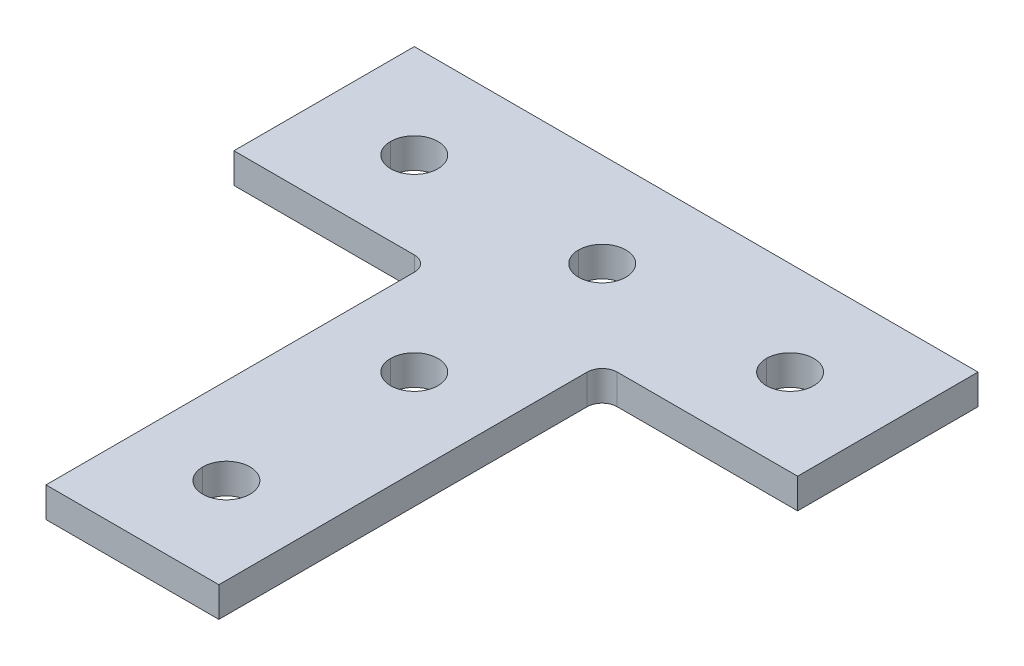
ISO-10303-21;
HEADER;
FILE_DESCRIPTION(('STEP AP214'),'2;1');
FILE_NAME('part.step','',(''),(''),'','','');
FILE_SCHEMA(('AUTOMOTIVE_DESIGN { 1 0 10303 214 1 1 1 1 }'));
ENDSEC;
DATA;
#1=APPLICATION_CONTEXT('core data for automotive mechanical design processes');
#2=APPLICATION_PROTOCOL_DEFINITION('international standard','automotive_design',2000,#1);
#3=PRODUCT_CONTEXT('',#1,'mechanical');
#4=PRODUCT('Part','Part','',(#3));
#5=PRODUCT_RELATED_PRODUCT_CATEGORY('part','',(#4));
#6=PRODUCT_DEFINITION_FORMATION('','',#4);
#7=PRODUCT_DEFINITION_CONTEXT('part definition',#1,'design');
#8=PRODUCT_DEFINITION('design','',#6,#7);
#9=PRODUCT_DEFINITION_SHAPE('','',#8);
#10=(LENGTH_UNIT() NAMED_UNIT(*) SI_UNIT(.MILLI.,.METRE.));
#11=(NAMED_UNIT(*) PLANE_ANGLE_UNIT() SI_UNIT($,.RADIAN.));
#12=(NAMED_UNIT(*) SI_UNIT($,.STERADIAN.) SOLID_ANGLE_UNIT());
#13=UNCERTAINTY_MEASURE_WITH_UNIT(LENGTH_MEASURE(1.E-05),#10,'distance_accuracy_value','');
#14=(GEOMETRIC_REPRESENTATION_CONTEXT(3) GLOBAL_UNCERTAINTY_ASSIGNED_CONTEXT((#13)) GLOBAL_UNIT_ASSIGNED_CONTEXT((#10,
#11,#12)) REPRESENTATION_CONTEXT('',''));
#15=CARTESIAN_POINT('',(0.,0.,0.));
#16=DIRECTION('',(0.,0.,1.));
#17=DIRECTION('',(1.,0.,0.));
#18=AXIS2_PLACEMENT_3D('',#15,#16,#17);
#19=CARTESIAN_POINT('',(37.5,4.,-37.5));
#20=DIRECTION('',(0.,0.,1.));
#21=DIRECTION('',(1.,0.,0.));
#22=AXIS2_PLACEMENT_3D('',#19,#20,#21);
#23=PLANE('',#22);
#24=DIRECTION('',(-1.,0.,0.));
#25=VECTOR('',#24,1.);
#26=CARTESIAN_POINT('',(37.5,0.,-37.5));
#27=LINE('',#26,#25);
#28=CARTESIAN_POINT('',(37.5,0.,-37.5));
#29=VERTEX_POINT('',#28);
#30=CARTESIAN_POINT('',(-37.5,0.,-37.5));
#31=VERTEX_POINT('',#30);
#32=EDGE_CURVE('E11',#29,#31,#27,.T.);
#33=ORIENTED_EDGE('',*,*,#32,.T.);
#34=DIRECTION('',(0.,-1.,0.));
#35=VECTOR('',#34,1.);
#36=CARTESIAN_POINT('',(-37.5,4.,-37.5));
#37=LINE('',#36,#35);
#38=CARTESIAN_POINT('',(-37.5,4.,-37.5));
#39=VERTEX_POINT('',#38);
#40=EDGE_CURVE('E25',#39,#31,#37,.T.);
#41=ORIENTED_EDGE('',*,*,#40,.F.);
#42=DIRECTION('',(-1.,0.,0.));
#43=VECTOR('',#42,1.);
#44=CARTESIAN_POINT('',(37.5,4.,-37.5));
#45=LINE('',#44,#43);
#46=CARTESIAN_POINT('',(37.5,4.,-37.5));
#47=VERTEX_POINT('',#46);
#48=EDGE_CURVE('E369',#47,#39,#45,.T.);
#49=ORIENTED_EDGE('',*,*,#48,.F.);
#50=DIRECTION('',(0.,-1.,0.));
#51=VECTOR('',#50,1.);
#52=CARTESIAN_POINT('',(37.5,4.,-37.5));
#53=LINE('',#52,#51);
#54=EDGE_CURVE('E365',#47,#29,#53,.T.);
#55=ORIENTED_EDGE('',*,*,#54,.T.);
#56=EDGE_LOOP('',(#33,#41,#49,#55));
#57=FACE_BOUND('',#56,.T.);
#58=ADVANCED_FACE('F17',(#57),#23,.F.);
#59=CARTESIAN_POINT('',(37.5,4.,-13.5));
#60=DIRECTION('',(-1.,0.,0.));
#61=DIRECTION('',(0.,0.,1.));
#62=AXIS2_PLACEMENT_3D('',#59,#60,#61);
#63=PLANE('',#62);
#64=DIRECTION('',(0.,0.,-1.));
#65=VECTOR('',#64,1.);
#66=CARTESIAN_POINT('',(37.5,0.,-13.5));
#67=LINE('',#66,#65);
#68=CARTESIAN_POINT('',(37.5,0.,-13.5));
#69=VERTEX_POINT('',#68);
#70=EDGE_CURVE('E360',#69,#29,#67,.T.);
#71=ORIENTED_EDGE('',*,*,#70,.T.);
#72=ORIENTED_EDGE('',*,*,#54,.F.);
#73=DIRECTION('',(0.,0.,-1.));
#74=VECTOR('',#73,1.);
#75=CARTESIAN_POINT('',(37.5,4.,-13.5));
#76=LINE('',#75,#74);
#77=CARTESIAN_POINT('',(37.5,4.,-13.5));
#78=VERTEX_POINT('',#77);
#79=EDGE_CURVE('E355',#78,#47,#76,.T.);
#80=ORIENTED_EDGE('',*,*,#79,.F.);
#81=DIRECTION('',(0.,-1.,0.));
#82=VECTOR('',#81,1.);
#83=CARTESIAN_POINT('',(37.5,4.,-13.5));
#84=LINE('',#83,#82);
#85=EDGE_CURVE('E351',#78,#69,#84,.T.);
#86=ORIENTED_EDGE('',*,*,#85,.T.);
#87=EDGE_LOOP('',(#71,#72,#80,#86));
#88=FACE_BOUND('',#87,.T.);
#89=ADVANCED_FACE('F381',(#88),#63,.F.);
#90=CARTESIAN_POINT('',(13.5,4.,-13.5));
#91=DIRECTION('',(0.,0.,-1.));
#92=DIRECTION('',(-1.,0.,0.));
#93=AXIS2_PLACEMENT_3D('',#90,#91,#92);
#94=PLANE('',#93);
#95=DIRECTION('',(1.,0.,0.));
#96=VECTOR('',#95,1.);
#97=CARTESIAN_POINT('',(13.5,0.,-13.5));
#98=LINE('',#97,#96);
#99=CARTESIAN_POINT('',(13.5,0.,-13.5));
#100=VERTEX_POINT('',#99);
#101=EDGE_CURVE('E346',#100,#69,#98,.T.);
#102=ORIENTED_EDGE('',*,*,#101,.T.);
#103=ORIENTED_EDGE('',*,*,#85,.F.);
#104=DIRECTION('',(1.,0.,0.));
#105=VECTOR('',#104,1.);
#106=CARTESIAN_POINT('',(13.5,4.,-13.5));
#107=LINE('',#106,#105);
#108=CARTESIAN_POINT('',(13.5,4.,-13.5));
#109=VERTEX_POINT('',#108);
#110=EDGE_CURVE('E341',#109,#78,#107,.T.);
#111=ORIENTED_EDGE('',*,*,#110,.F.);
#112=DIRECTION('',(0.,-1.,0.));
#113=VECTOR('',#112,1.);
#114=CARTESIAN_POINT('',(13.5,4.,-13.5));
#115=LINE('',#114,#113);
#116=EDGE_CURVE('E337',#109,#100,#115,.T.);
#117=ORIENTED_EDGE('',*,*,#116,.T.);
#118=EDGE_LOOP('',(#102,#103,#111,#117));
#119=FACE_BOUND('',#118,.T.);
#120=ADVANCED_FACE('F388',(#119),#94,.F.);
#121=CARTESIAN_POINT('',(13.5000000000003,4.,-11.4999999999997));
#122=DIRECTION('',(0.,1.,0.));
#123=DIRECTION('',(0.707106781186495,0.,0.707106781186601));
#124=AXIS2_PLACEMENT_3D('',#121,#122,#123);
#125=CYLINDRICAL_SURFACE('',#124,2.);
#126=DIRECTION('',(0.,-1.,0.));
#127=VECTOR('',#126,1.);
#128=CARTESIAN_POINT('',(11.5,4.,-11.5));
#129=LINE('',#128,#127);
#130=CARTESIAN_POINT('',(11.5,4.,-11.5));
#131=VERTEX_POINT('',#130);
#132=CARTESIAN_POINT('',(11.5,0.,-11.5));
#133=VERTEX_POINT('',#132);
#134=EDGE_CURVE('E333',#131,#133,#129,.T.);
#135=ORIENTED_EDGE('',*,*,#134,.T.);
#136=CARTESIAN_POINT('',(13.5000000000003,0.,-11.4999999999997));
#137=DIRECTION('',(0.,1.,0.));
#138=DIRECTION('',(1.,0.,0.));
#139=AXIS2_PLACEMENT_3D('',#136,#137,#138);
#140=CIRCLE('',#139,2.);
#141=EDGE_CURVE('E328',#100,#133,#140,.T.);
#142=ORIENTED_EDGE('',*,*,#141,.F.);
#143=ORIENTED_EDGE('',*,*,#116,.F.);
#144=CARTESIAN_POINT('',(13.5000000000003,4.,-11.4999999999997));
#145=DIRECTION('',(0.,1.,0.));
#146=DIRECTION('',(1.,0.,0.));
#147=AXIS2_PLACEMENT_3D('',#144,#145,#146);
#148=CIRCLE('',#147,2.);
#149=EDGE_CURVE('E324',#109,#131,#148,.T.);
#150=ORIENTED_EDGE('',*,*,#149,.T.);
#151=EDGE_LOOP('',(#135,#142,#143,#150));
#152=FACE_BOUND('',#151,.T.);
#153=ADVANCED_FACE('F392',(#152),#125,.F.);
#154=CARTESIAN_POINT('',(-13.5000000000003,4.,-11.4999999999997));
#155=DIRECTION('',(0.,1.,0.));
#156=DIRECTION('',(0.,0.,1.));
#157=AXIS2_PLACEMENT_3D('',#154,#155,#156);
#158=PLANE('',#157);
#159=CARTESIAN_POINT('',(-25.,4.,-25.));
#160=DIRECTION('',(0.,1.,0.));
#161=DIRECTION('',(1.,0.,0.));
#162=AXIS2_PLACEMENT_3D('',#159,#160,#161);
#163=CIRCLE('',#162,3.15);
#164=CARTESIAN_POINT('',(-21.85,4.,-25.));
#165=VERTEX_POINT('',#164);
#166=CARTESIAN_POINT('',(-28.15,4.,-25.));
#167=VERTEX_POINT('',#166);
#168=EDGE_CURVE('E319',#165,#167,#163,.T.);
#169=ORIENTED_EDGE('',*,*,#168,.F.);
#170=CARTESIAN_POINT('',(-25.,4.,-25.));
#171=DIRECTION('',(0.,1.,0.));
#172=DIRECTION('',(1.,0.,0.));
#173=AXIS2_PLACEMENT_3D('',#170,#171,#172);
#174=CIRCLE('',#173,3.15);
#175=EDGE_CURVE('E314',#167,#165,#174,.T.);
#176=ORIENTED_EDGE('',*,*,#175,.F.);
#177=EDGE_LOOP('',(#169,#176));
#178=FACE_BOUND('',#177,.T.);
#179=CARTESIAN_POINT('',(0.,4.,25.));
#180=DIRECTION('',(0.,1.,0.));
#181=DIRECTION('',(1.,0.,0.));
#182=AXIS2_PLACEMENT_3D('',#179,#180,#181);
#183=CIRCLE('',#182,3.15);
#184=CARTESIAN_POINT('',(3.15,4.,25.));
#185=VERTEX_POINT('',#184);
#186=CARTESIAN_POINT('',(-3.15,4.,25.));
#187=VERTEX_POINT('',#186);
#188=EDGE_CURVE('E309',#185,#187,#183,.T.);
#189=ORIENTED_EDGE('',*,*,#188,.F.);
#190=CARTESIAN_POINT('',(0.,4.,25.));
#191=DIRECTION('',(0.,1.,0.));
#192=DIRECTION('',(1.,0.,0.));
#193=AXIS2_PLACEMENT_3D('',#190,#191,#192);
#194=CIRCLE('',#193,3.15);
#195=EDGE_CURVE('E304',#187,#185,#194,.T.);
#196=ORIENTED_EDGE('',*,*,#195,.F.);
#197=EDGE_LOOP('',(#189,#196));
#198=FACE_BOUND('',#197,.T.);
#199=CARTESIAN_POINT('',(0.,4.,0.));
#200=DIRECTION('',(0.,1.,0.));
#201=DIRECTION('',(1.,0.,0.));
#202=AXIS2_PLACEMENT_3D('',#199,#200,#201);
#203=CIRCLE('',#202,3.15);
#204=CARTESIAN_POINT('',(3.15,4.,0.));
#205=VERTEX_POINT('',#204);
#206=CARTESIAN_POINT('',(-3.15,4.,0.));
#207=VERTEX_POINT('',#206);
#208=EDGE_CURVE('E299',#205,#207,#203,.T.);
#209=ORIENTED_EDGE('',*,*,#208,.F.);
#210=CARTESIAN_POINT('',(0.,4.,0.));
#211=DIRECTION('',(0.,1.,0.));
#212=DIRECTION('',(1.,0.,0.));
#213=AXIS2_PLACEMENT_3D('',#210,#211,#212);
#214=CIRCLE('',#213,3.15);
#215=EDGE_CURVE('E294',#207,#205,#214,.T.);
#216=ORIENTED_EDGE('',*,*,#215,.F.);
#217=EDGE_LOOP('',(#209,#216));
#218=FACE_BOUND('',#217,.T.);
#219=CARTESIAN_POINT('',(0.,4.,-25.));
#220=DIRECTION('',(0.,1.,0.));
#221=DIRECTION('',(1.,0.,0.));
#222=AXIS2_PLACEMENT_3D('',#219,#220,#221);
#223=CIRCLE('',#222,3.15);
#224=CARTESIAN_POINT('',(3.15,4.,-25.));
#225=VERTEX_POINT('',#224);
#226=CARTESIAN_POINT('',(-3.15,4.,-25.));
#227=VERTEX_POINT('',#226);
#228=EDGE_CURVE('E289',#225,#227,#223,.T.);
#229=ORIENTED_EDGE('',*,*,#228,.F.);
#230=CARTESIAN_POINT('',(0.,4.,-25.));
#231=DIRECTION('',(0.,1.,0.));
#232=DIRECTION('',(1.,0.,0.));
#233=AXIS2_PLACEMENT_3D('',#230,#231,#232);
#234=CIRCLE('',#233,3.15);
#235=EDGE_CURVE('E284',#227,#225,#234,.T.);
#236=ORIENTED_EDGE('',*,*,#235,.F.);
#237=EDGE_LOOP('',(#229,#236));
#238=FACE_BOUND('',#237,.T.);
#239=CARTESIAN_POINT('',(25.,4.,-25.));
#240=DIRECTION('',(0.,1.,0.));
#241=DIRECTION('',(1.,0.,0.));
#242=AXIS2_PLACEMENT_3D('',#239,#240,#241);
#243=CIRCLE('',#242,3.15);
#244=CARTESIAN_POINT('',(28.15,4.,-25.));
#245=VERTEX_POINT('',#244);
#246=CARTESIAN_POINT('',(21.85,4.,-25.));
#247=VERTEX_POINT('',#246);
#248=EDGE_CURVE('E279',#245,#247,#243,.T.);
#249=ORIENTED_EDGE('',*,*,#248,.F.);
#250=CARTESIAN_POINT('',(25.,4.,-25.));
#251=DIRECTION('',(0.,1.,0.));
#252=DIRECTION('',(1.,0.,0.));
#253=AXIS2_PLACEMENT_3D('',#250,#251,#252);
#254=CIRCLE('',#253,3.15);
#255=EDGE_CURVE('E274',#247,#245,#254,.T.);
#256=ORIENTED_EDGE('',*,*,#255,.F.);
#257=EDGE_LOOP('',(#249,#256));
#258=FACE_BOUND('',#257,.T.);
#259=DIRECTION('',(0.,0.,1.));
#260=VECTOR('',#259,1.);
#261=CARTESIAN_POINT('',(-37.5,4.,-37.5));
#262=LINE('',#261,#260);
#263=CARTESIAN_POINT('',(-37.5,4.,-13.5));
#264=VERTEX_POINT('',#263);
#265=EDGE_CURVE('E270',#39,#264,#262,.T.);
#266=ORIENTED_EDGE('',*,*,#265,.T.);
#267=DIRECTION('',(1.,0.,0.));
#268=VECTOR('',#267,1.);
#269=CARTESIAN_POINT('',(-37.5,4.,-13.5));
#270=LINE('',#269,#268);
#271=CARTESIAN_POINT('',(-13.5,4.,-13.5));
#272=VERTEX_POINT('',#271);
#273=EDGE_CURVE('E165',#264,#272,#270,.T.);
#274=ORIENTED_EDGE('',*,*,#273,.T.);
#275=CARTESIAN_POINT('',(-13.5000000000003,4.,-11.4999999999997));
#276=DIRECTION('',(0.,1.,0.));
#277=DIRECTION('',(1.,0.,0.));
#278=AXIS2_PLACEMENT_3D('',#275,#276,#277);
#279=CIRCLE('',#278,2.);
#280=CARTESIAN_POINT('',(-11.5,4.,-11.5));
#281=VERTEX_POINT('',#280);
#282=EDGE_CURVE('E262',#281,#272,#279,.T.);
#283=ORIENTED_EDGE('',*,*,#282,.F.);
#284=DIRECTION('',(0.,0.,1.));
#285=VECTOR('',#284,1.);
#286=CARTESIAN_POINT('',(-11.5,4.,-11.5));
#287=LINE('',#286,#285);
#288=CARTESIAN_POINT('',(-11.5,4.,37.5));
#289=VERTEX_POINT('',#288);
#290=EDGE_CURVE('E258',#281,#289,#287,.T.);
#291=ORIENTED_EDGE('',*,*,#290,.T.);
#292=DIRECTION('',(1.,0.,0.));
#293=VECTOR('',#292,1.);
#294=CARTESIAN_POINT('',(-11.5,4.,37.5));
#295=LINE('',#294,#293);
#296=CARTESIAN_POINT('',(11.5,4.,37.5));
#297=VERTEX_POINT('',#296);
#298=EDGE_CURVE('E254',#289,#297,#295,.T.);
#299=ORIENTED_EDGE('',*,*,#298,.T.);
#300=DIRECTION('',(0.,0.,-1.));
#301=VECTOR('',#300,1.);
#302=CARTESIAN_POINT('',(11.5,4.,37.5));
#303=LINE('',#302,#301);
#304=EDGE_CURVE('E249',#297,#131,#303,.T.);
#305=ORIENTED_EDGE('',*,*,#304,.T.);
#306=ORIENTED_EDGE('',*,*,#149,.F.);
#307=ORIENTED_EDGE('',*,*,#110,.T.);
#308=ORIENTED_EDGE('',*,*,#79,.T.);
#309=ORIENTED_EDGE('',*,*,#48,.T.);
#310=EDGE_LOOP('',(#266,#274,#283,#291,#299,#305,#306,#307,#308,#309));
#311=FACE_BOUND('',#310,.T.);
#312=ADVANCED_FACE('F378',(#178,#198,#218,#238,#258,#311),#158,.T.);
#313=CARTESIAN_POINT('',(11.5,4.,37.5));
#314=DIRECTION('',(-1.,0.,0.));
#315=DIRECTION('',(0.,0.,1.));
#316=AXIS2_PLACEMENT_3D('',#313,#314,#315);
#317=PLANE('',#316);
#318=DIRECTION('',(0.,0.,-1.));
#319=VECTOR('',#318,1.);
#320=CARTESIAN_POINT('',(11.5,0.,37.5));
#321=LINE('',#320,#319);
#322=CARTESIAN_POINT('',(11.5,0.,37.5));
#323=VERTEX_POINT('',#322);
#324=EDGE_CURVE('E244',#323,#133,#321,.T.);
#325=ORIENTED_EDGE('',*,*,#324,.T.);
#326=ORIENTED_EDGE('',*,*,#134,.F.);
#327=ORIENTED_EDGE('',*,*,#304,.F.);
#328=DIRECTION('',(0.,-1.,0.));
#329=VECTOR('',#328,1.);
#330=CARTESIAN_POINT('',(11.5,4.,37.5));
#331=LINE('',#330,#329);
#332=EDGE_CURVE('E240',#297,#323,#331,.T.);
#333=ORIENTED_EDGE('',*,*,#332,.T.);
#334=EDGE_LOOP('',(#325,#326,#327,#333));
#335=FACE_BOUND('',#334,.T.);
#336=ADVANCED_FACE('F396',(#335),#317,.F.);
#337=CARTESIAN_POINT('',(-11.5,4.,37.5));
#338=DIRECTION('',(0.,0.,-1.));
#339=DIRECTION('',(-1.,0.,0.));
#340=AXIS2_PLACEMENT_3D('',#337,#338,#339);
#341=PLANE('',#340);
#342=DIRECTION('',(1.,0.,0.));
#343=VECTOR('',#342,1.);
#344=CARTESIAN_POINT('',(-11.5,0.,37.5));
#345=LINE('',#344,#343);
#346=CARTESIAN_POINT('',(-11.5,0.,37.5));
#347=VERTEX_POINT('',#346);
#348=EDGE_CURVE('E235',#347,#323,#345,.T.);
#349=ORIENTED_EDGE('',*,*,#348,.T.);
#350=ORIENTED_EDGE('',*,*,#332,.F.);
#351=ORIENTED_EDGE('',*,*,#298,.F.);
#352=DIRECTION('',(0.,-1.,0.));
#353=VECTOR('',#352,1.);
#354=CARTESIAN_POINT('',(-11.5,4.,37.5));
#355=LINE('',#354,#353);
#356=EDGE_CURVE('E231',#289,#347,#355,.T.);
#357=ORIENTED_EDGE('',*,*,#356,.T.);
#358=EDGE_LOOP('',(#349,#350,#351,#357));
#359=FACE_BOUND('',#358,.T.);
#360=ADVANCED_FACE('F400',(#359),#341,.F.);
#361=CARTESIAN_POINT('',(-11.5,4.,-11.5));
#362=DIRECTION('',(1.,0.,0.));
#363=DIRECTION('',(0.,0.,-1.));
#364=AXIS2_PLACEMENT_3D('',#361,#362,#363);
#365=PLANE('',#364);
#366=DIRECTION('',(0.,0.,1.));
#367=VECTOR('',#366,1.);
#368=CARTESIAN_POINT('',(-11.5,0.,-11.5));
#369=LINE('',#368,#367);
#370=CARTESIAN_POINT('',(-11.5,0.,-11.5));
#371=VERTEX_POINT('',#370);
#372=EDGE_CURVE('E226',#371,#347,#369,.T.);
#373=ORIENTED_EDGE('',*,*,#372,.T.);
#374=ORIENTED_EDGE('',*,*,#356,.F.);
#375=ORIENTED_EDGE('',*,*,#290,.F.);
#376=DIRECTION('',(0.,-1.,0.));
#377=VECTOR('',#376,1.);
#378=CARTESIAN_POINT('',(-11.5,4.,-11.5));
#379=LINE('',#378,#377);
#380=EDGE_CURVE('E222',#281,#371,#379,.T.);
#381=ORIENTED_EDGE('',*,*,#380,.T.);
#382=EDGE_LOOP('',(#373,#374,#375,#381));
#383=FACE_BOUND('',#382,.T.);
#384=ADVANCED_FACE('F405',(#383),#365,.F.);
#385=CARTESIAN_POINT('',(-13.5000000000003,4.,-11.4999999999997));
#386=DIRECTION('',(0.,1.,0.));
#387=DIRECTION('',(-0.707106781186548,0.,0.707106781186547));
#388=AXIS2_PLACEMENT_3D('',#385,#386,#387);
#389=CYLINDRICAL_SURFACE('',#388,2.);
#390=DIRECTION('',(0.,-1.,0.));
#391=VECTOR('',#390,1.);
#392=CARTESIAN_POINT('',(-13.5,4.,-13.5));
#393=LINE('',#392,#391);
#394=CARTESIAN_POINT('',(-13.5,0.,-13.5));
#395=VERTEX_POINT('',#394);
#396=EDGE_CURVE('E218',#272,#395,#393,.T.);
#397=ORIENTED_EDGE('',*,*,#396,.T.);
#398=CARTESIAN_POINT('',(-13.5000000000003,0.,-11.4999999999997));
#399=DIRECTION('',(0.,1.,0.));
#400=DIRECTION('',(1.,0.,0.));
#401=AXIS2_PLACEMENT_3D('',#398,#399,#400);
#402=CIRCLE('',#401,2.);
#403=EDGE_CURVE('E157',#371,#395,#402,.T.);
#404=ORIENTED_EDGE('',*,*,#403,.F.);
#405=ORIENTED_EDGE('',*,*,#380,.F.);
#406=ORIENTED_EDGE('',*,*,#282,.T.);
#407=EDGE_LOOP('',(#397,#404,#405,#406));
#408=FACE_BOUND('',#407,.T.);
#409=ADVANCED_FACE('F408',(#408),#389,.F.);
#410=CARTESIAN_POINT('',(-13.5000000000003,0.,-11.4999999999997));
#411=DIRECTION('',(0.,1.,0.));
#412=DIRECTION('',(0.,0.,1.));
#413=AXIS2_PLACEMENT_3D('',#410,#411,#412);
#414=PLANE('',#413);
#415=CARTESIAN_POINT('',(-25.,0.,-25.));
#416=DIRECTION('',(0.,1.,0.));
#417=DIRECTION('',(1.,0.,0.));
#418=AXIS2_PLACEMENT_3D('',#415,#416,#417);
#419=CIRCLE('',#418,3.15);
#420=CARTESIAN_POINT('',(-21.85,0.,-25.));
#421=VERTEX_POINT('',#420);
#422=CARTESIAN_POINT('',(-28.15,0.,-25.));
#423=VERTEX_POINT('',#422);
#424=EDGE_CURVE('E211',#421,#423,#419,.T.);
#425=ORIENTED_EDGE('',*,*,#424,.T.);
#426=CARTESIAN_POINT('',(-25.,0.,-25.));
#427=DIRECTION('',(0.,1.,0.));
#428=DIRECTION('',(1.,0.,0.));
#429=AXIS2_PLACEMENT_3D('',#426,#427,#428);
#430=CIRCLE('',#429,3.15);
#431=EDGE_CURVE('E207',#423,#421,#430,.T.);
#432=ORIENTED_EDGE('',*,*,#431,.T.);
#433=EDGE_LOOP('',(#425,#432));
#434=FACE_BOUND('',#433,.T.);
#435=CARTESIAN_POINT('',(0.,0.,25.));
#436=DIRECTION('',(0.,1.,0.));
#437=DIRECTION('',(1.,0.,0.));
#438=AXIS2_PLACEMENT_3D('',#435,#436,#437);
#439=CIRCLE('',#438,3.15);
#440=CARTESIAN_POINT('',(3.15,0.,25.));
#441=VERTEX_POINT('',#440);
#442=CARTESIAN_POINT('',(-3.15,0.,25.));
#443=VERTEX_POINT('',#442);
#444=EDGE_CURVE('E203',#441,#443,#439,.T.);
#445=ORIENTED_EDGE('',*,*,#444,.T.);
#446=CARTESIAN_POINT('',(0.,0.,25.));
#447=DIRECTION('',(0.,1.,0.));
#448=DIRECTION('',(1.,0.,0.));
#449=AXIS2_PLACEMENT_3D('',#446,#447,#448);
#450=CIRCLE('',#449,3.15);
#451=EDGE_CURVE('E199',#443,#441,#450,.T.);
#452=ORIENTED_EDGE('',*,*,#451,.T.);
#453=EDGE_LOOP('',(#445,#452));
#454=FACE_BOUND('',#453,.T.);
#455=CARTESIAN_POINT('',(0.,0.,0.));
#456=DIRECTION('',(0.,1.,0.));
#457=DIRECTION('',(1.,0.,0.));
#458=AXIS2_PLACEMENT_3D('',#455,#456,#457);
#459=CIRCLE('',#458,3.15);
#460=CARTESIAN_POINT('',(3.15,0.,0.));
#461=VERTEX_POINT('',#460);
#462=CARTESIAN_POINT('',(-3.15,0.,0.));
#463=VERTEX_POINT('',#462);
#464=EDGE_CURVE('E195',#461,#463,#459,.T.);
#465=ORIENTED_EDGE('',*,*,#464,.T.);
#466=CARTESIAN_POINT('',(0.,0.,0.));
#467=DIRECTION('',(0.,1.,0.));
#468=DIRECTION('',(1.,0.,0.));
#469=AXIS2_PLACEMENT_3D('',#466,#467,#468);
#470=CIRCLE('',#469,3.15);
#471=EDGE_CURVE('E191',#463,#461,#470,.T.);
#472=ORIENTED_EDGE('',*,*,#471,.T.);
#473=EDGE_LOOP('',(#465,#472));
#474=FACE_BOUND('',#473,.T.);
#475=CARTESIAN_POINT('',(0.,0.,-25.));
#476=DIRECTION('',(0.,1.,0.));
#477=DIRECTION('',(1.,0.,0.));
#478=AXIS2_PLACEMENT_3D('',#475,#476,#477);
#479=CIRCLE('',#478,3.15);
#480=CARTESIAN_POINT('',(3.15,0.,-25.));
#481=VERTEX_POINT('',#480);
#482=CARTESIAN_POINT('',(-3.15,0.,-25.));
#483=VERTEX_POINT('',#482);
#484=EDGE_CURVE('E187',#481,#483,#479,.T.);
#485=ORIENTED_EDGE('',*,*,#484,.T.);
#486=CARTESIAN_POINT('',(0.,0.,-25.));
#487=DIRECTION('',(0.,1.,0.));
#488=DIRECTION('',(1.,0.,0.));
#489=AXIS2_PLACEMENT_3D('',#486,#487,#488);
#490=CIRCLE('',#489,3.15);
#491=EDGE_CURVE('E183',#483,#481,#490,.T.);
#492=ORIENTED_EDGE('',*,*,#491,.T.);
#493=EDGE_LOOP('',(#485,#492));
#494=FACE_BOUND('',#493,.T.);
#495=CARTESIAN_POINT('',(25.,0.,-25.));
#496=DIRECTION('',(0.,1.,0.));
#497=DIRECTION('',(1.,0.,0.));
#498=AXIS2_PLACEMENT_3D('',#495,#496,#497);
#499=CIRCLE('',#498,3.15);
#500=CARTESIAN_POINT('',(28.15,0.,-25.));
#501=VERTEX_POINT('',#500);
#502=CARTESIAN_POINT('',(21.85,0.,-25.));
#503=VERTEX_POINT('',#502);
#504=EDGE_CURVE('E173',#501,#503,#499,.T.);
#505=ORIENTED_EDGE('',*,*,#504,.T.);
#506=CARTESIAN_POINT('',(25.,0.,-25.));
#507=DIRECTION('',(0.,1.,0.));
#508=DIRECTION('',(1.,0.,0.));
#509=AXIS2_PLACEMENT_3D('',#506,#507,#508);
#510=CIRCLE('',#509,3.15);
#511=EDGE_CURVE('E171',#503,#501,#510,.T.);
#512=ORIENTED_EDGE('',*,*,#511,.T.);
#513=EDGE_LOOP('',(#505,#512));
#514=FACE_BOUND('',#513,.T.);
#515=DIRECTION('',(0.,0.,1.));
#516=VECTOR('',#515,1.);
#517=CARTESIAN_POINT('',(-37.5,0.,-37.5));
#518=LINE('',#517,#516);
#519=CARTESIAN_POINT('',(-37.5,0.,-13.5));
#520=VERTEX_POINT('',#519);
#521=EDGE_CURVE('E154',#31,#520,#518,.T.);
#522=ORIENTED_EDGE('',*,*,#521,.F.);
#523=ORIENTED_EDGE('',*,*,#32,.F.);
#524=ORIENTED_EDGE('',*,*,#70,.F.);
#525=ORIENTED_EDGE('',*,*,#101,.F.);
#526=ORIENTED_EDGE('',*,*,#141,.T.);
#527=ORIENTED_EDGE('',*,*,#324,.F.);
#528=ORIENTED_EDGE('',*,*,#348,.F.);
#529=ORIENTED_EDGE('',*,*,#372,.F.);
#530=ORIENTED_EDGE('',*,*,#403,.T.);
#531=DIRECTION('',(1.,0.,0.));
#532=VECTOR('',#531,1.);
#533=CARTESIAN_POINT('',(-37.5,0.,-13.5));
#534=LINE('',#533,#532);
#535=EDGE_CURVE('E150',#520,#395,#534,.T.);
#536=ORIENTED_EDGE('',*,*,#535,.F.);
#537=EDGE_LOOP('',(#522,#523,#524,#525,#526,#527,#528,#529,#530,#536));
#538=FACE_BOUND('',#537,.T.);
#539=ADVANCED_FACE('F152',(#434,#454,#474,#494,#514,#538),#414,.F.);
#540=CARTESIAN_POINT('',(-37.5,4.,-13.5));
#541=DIRECTION('',(0.,0.,-1.));
#542=DIRECTION('',(-1.,0.,0.));
#543=AXIS2_PLACEMENT_3D('',#540,#541,#542);
#544=PLANE('',#543);
#545=ORIENTED_EDGE('',*,*,#535,.T.);
#546=ORIENTED_EDGE('',*,*,#396,.F.);
#547=ORIENTED_EDGE('',*,*,#273,.F.);
#548=DIRECTION('',(0.,-1.,0.));
#549=VECTOR('',#548,1.);
#550=CARTESIAN_POINT('',(-37.5,4.,-13.5));
#551=LINE('',#550,#549);
#552=EDGE_CURVE('E160',#264,#520,#551,.T.);
#553=ORIENTED_EDGE('',*,*,#552,.T.);
#554=EDGE_LOOP('',(#545,#546,#547,#553));
#555=FACE_BOUND('',#554,.T.);
#556=ADVANCED_FACE('F164',(#555),#544,.F.);
#557=CARTESIAN_POINT('',(-37.5,4.,-37.5));
#558=DIRECTION('',(1.,0.,0.));
#559=DIRECTION('',(0.,0.,-1.));
#560=AXIS2_PLACEMENT_3D('',#557,#558,#559);
#561=PLANE('',#560);
#562=ORIENTED_EDGE('',*,*,#521,.T.);
#563=ORIENTED_EDGE('',*,*,#552,.F.);
#564=ORIENTED_EDGE('',*,*,#265,.F.);
#565=ORIENTED_EDGE('',*,*,#40,.T.);
#566=EDGE_LOOP('',(#562,#563,#564,#565));
#567=FACE_BOUND('',#566,.T.);
#568=ADVANCED_FACE('F170',(#567),#561,.F.);
#569=CARTESIAN_POINT('',(25.,4.,-25.));
#570=DIRECTION('',(0.,1.,0.));
#571=DIRECTION('',(0.,0.,-1.));
#572=AXIS2_PLACEMENT_3D('',#569,#570,#571);
#573=CYLINDRICAL_SURFACE('',#572,3.15);
#574=ORIENTED_EDGE('',*,*,#511,.F.);
#575=DIRECTION('',(0.,1.,0.));
#576=VECTOR('',#575,1.);
#577=CARTESIAN_POINT('',(21.85,0.,-25.));
#578=LINE('',#577,#576);
#579=EDGE_CURVE('E168',#503,#247,#578,.T.);
#580=ORIENTED_EDGE('',*,*,#579,.T.);
#581=ORIENTED_EDGE('',*,*,#255,.T.);
#582=DIRECTION('',(0.,1.,0.));
#583=VECTOR('',#582,1.);
#584=CARTESIAN_POINT('',(28.15,0.,-25.));
#585=LINE('',#584,#583);
#586=EDGE_CURVE('E703',#501,#245,#585,.T.);
#587=ORIENTED_EDGE('',*,*,#586,.F.);
#588=EDGE_LOOP('',(#574,#580,#581,#587));
#589=FACE_BOUND('',#588,.T.);
#590=ADVANCED_FACE('F475',(#589),#573,.F.);
#591=CARTESIAN_POINT('',(25.,4.,-25.));
#592=DIRECTION('',(0.,1.,0.));
#593=DIRECTION('',(0.,0.,1.));
#594=AXIS2_PLACEMENT_3D('',#591,#592,#593);
#595=CYLINDRICAL_SURFACE('',#594,3.15);
#596=ORIENTED_EDGE('',*,*,#248,.T.);
#597=ORIENTED_EDGE('',*,*,#579,.F.);
#598=ORIENTED_EDGE('',*,*,#504,.F.);
#599=ORIENTED_EDGE('',*,*,#586,.T.);
#600=EDGE_LOOP('',(#596,#597,#598,#599));
#601=FACE_BOUND('',#600,.T.);
#602=ADVANCED_FACE('F484',(#601),#595,.F.);
#603=CARTESIAN_POINT('',(0.,4.,-25.));
#604=DIRECTION('',(0.,1.,0.));
#605=DIRECTION('',(0.,0.,-1.));
#606=AXIS2_PLACEMENT_3D('',#603,#604,#605);
#607=CYLINDRICAL_SURFACE('',#606,3.15);
#608=ORIENTED_EDGE('',*,*,#491,.F.);
#609=DIRECTION('',(0.,1.,0.));
#610=VECTOR('',#609,1.);
#611=CARTESIAN_POINT('',(-3.15,0.,-25.));
#612=LINE('',#611,#610);
#613=EDGE_CURVE('E698',#483,#227,#612,.T.);
#614=ORIENTED_EDGE('',*,*,#613,.T.);
#615=ORIENTED_EDGE('',*,*,#235,.T.);
#616=DIRECTION('',(0.,1.,0.));
#617=VECTOR('',#616,1.);
#618=CARTESIAN_POINT('',(3.15,0.,-25.));
#619=LINE('',#618,#617);
#620=EDGE_CURVE('E693',#481,#225,#619,.T.);
#621=ORIENTED_EDGE('',*,*,#620,.F.);
#622=EDGE_LOOP('',(#608,#614,#615,#621));
#623=FACE_BOUND('',#622,.T.);
#624=ADVANCED_FACE('F494',(#623),#607,.F.);
#625=CARTESIAN_POINT('',(0.,4.,-25.));
#626=DIRECTION('',(0.,1.,0.));
#627=DIRECTION('',(0.,0.,1.));
#628=AXIS2_PLACEMENT_3D('',#625,#626,#627);
#629=CYLINDRICAL_SURFACE('',#628,3.15);
#630=ORIENTED_EDGE('',*,*,#228,.T.);
#631=ORIENTED_EDGE('',*,*,#613,.F.);
#632=ORIENTED_EDGE('',*,*,#484,.F.);
#633=ORIENTED_EDGE('',*,*,#620,.T.);
#634=EDGE_LOOP('',(#630,#631,#632,#633));
#635=FACE_BOUND('',#634,.T.);
#636=ADVANCED_FACE('F504',(#635),#629,.F.);
#637=CARTESIAN_POINT('',(0.,4.,0.));
#638=DIRECTION('',(0.,1.,0.));
#639=DIRECTION('',(0.,0.,-1.));
#640=AXIS2_PLACEMENT_3D('',#637,#638,#639);
#641=CYLINDRICAL_SURFACE('',#640,3.15);
#642=ORIENTED_EDGE('',*,*,#471,.F.);
#643=DIRECTION('',(0.,1.,0.));
#644=VECTOR('',#643,1.);
#645=CARTESIAN_POINT('',(-3.15,0.,0.));
#646=LINE('',#645,#644);
#647=EDGE_CURVE('E688',#463,#207,#646,.T.);
#648=ORIENTED_EDGE('',*,*,#647,.T.);
#649=ORIENTED_EDGE('',*,*,#215,.T.);
#650=DIRECTION('',(0.,1.,0.));
#651=VECTOR('',#650,1.);
#652=CARTESIAN_POINT('',(3.15,0.,0.));
#653=LINE('',#652,#651);
#654=EDGE_CURVE('E683',#461,#205,#653,.T.);
#655=ORIENTED_EDGE('',*,*,#654,.F.);
#656=EDGE_LOOP('',(#642,#648,#649,#655));
#657=FACE_BOUND('',#656,.T.);
#658=ADVANCED_FACE('F514',(#657),#641,.F.);
#659=CARTESIAN_POINT('',(0.,4.,0.));
#660=DIRECTION('',(0.,1.,0.));
#661=DIRECTION('',(0.,0.,1.));
#662=AXIS2_PLACEMENT_3D('',#659,#660,#661);
#663=CYLINDRICAL_SURFACE('',#662,3.15);
#664=ORIENTED_EDGE('',*,*,#208,.T.);
#665=ORIENTED_EDGE('',*,*,#647,.F.);
#666=ORIENTED_EDGE('',*,*,#464,.F.);
#667=ORIENTED_EDGE('',*,*,#654,.T.);
#668=EDGE_LOOP('',(#664,#665,#666,#667));
#669=FACE_BOUND('',#668,.T.);
#670=ADVANCED_FACE('F524',(#669),#663,.F.);
#671=CARTESIAN_POINT('',(0.,4.,25.));
#672=DIRECTION('',(0.,1.,0.));
#673=DIRECTION('',(0.,0.,-1.));
#674=AXIS2_PLACEMENT_3D('',#671,#672,#673);
#675=CYLINDRICAL_SURFACE('',#674,3.15);
#676=ORIENTED_EDGE('',*,*,#451,.F.);
#677=DIRECTION('',(0.,1.,0.));
#678=VECTOR('',#677,1.);
#679=CARTESIAN_POINT('',(-3.15,0.,25.));
#680=LINE('',#679,#678);
#681=EDGE_CURVE('E671',#443,#187,#680,.T.);
#682=ORIENTED_EDGE('',*,*,#681,.T.);
#683=ORIENTED_EDGE('',*,*,#195,.T.);
#684=DIRECTION('',(0.,1.,0.));
#685=VECTOR('',#684,1.);
#686=CARTESIAN_POINT('',(3.15,0.,25.));
#687=LINE('',#686,#685);
#688=EDGE_CURVE('E668',#441,#185,#687,.T.);
#689=ORIENTED_EDGE('',*,*,#688,.F.);
#690=EDGE_LOOP('',(#676,#682,#683,#689));
#691=FACE_BOUND('',#690,.T.);
#692=ADVANCED_FACE('F534',(#691),#675,.F.);
#693=CARTESIAN_POINT('',(0.,4.,25.));
#694=DIRECTION('',(0.,1.,0.));
#695=DIRECTION('',(0.,0.,1.));
#696=AXIS2_PLACEMENT_3D('',#693,#694,#695);
#697=CYLINDRICAL_SURFACE('',#696,3.15);
#698=ORIENTED_EDGE('',*,*,#188,.T.);
#699=ORIENTED_EDGE('',*,*,#681,.F.);
#700=ORIENTED_EDGE('',*,*,#444,.F.);
#701=ORIENTED_EDGE('',*,*,#688,.T.);
#702=EDGE_LOOP('',(#698,#699,#700,#701));
#703=FACE_BOUND('',#702,.T.);
#704=ADVANCED_FACE('F544',(#703),#697,.F.);
#705=CARTESIAN_POINT('',(-25.,4.,-25.));
#706=DIRECTION('',(0.,1.,0.));
#707=DIRECTION('',(0.,0.,-1.));
#708=AXIS2_PLACEMENT_3D('',#705,#706,#707);
#709=CYLINDRICAL_SURFACE('',#708,3.15);
#710=ORIENTED_EDGE('',*,*,#431,.F.);
#711=DIRECTION('',(0.,1.,0.));
#712=VECTOR('',#711,1.);
#713=CARTESIAN_POINT('',(-28.15,0.,-25.));
#714=LINE('',#713,#712);
#715=EDGE_CURVE('E663',#423,#167,#714,.T.);
#716=ORIENTED_EDGE('',*,*,#715,.T.);
#717=ORIENTED_EDGE('',*,*,#175,.T.);
#718=DIRECTION('',(0.,1.,0.));
#719=VECTOR('',#718,1.);
#720=CARTESIAN_POINT('',(-21.85,0.,-25.));
#721=LINE('',#720,#719);
#722=EDGE_CURVE('E665',#421,#165,#721,.T.);
#723=ORIENTED_EDGE('',*,*,#722,.F.);
#724=EDGE_LOOP('',(#710,#716,#717,#723));
#725=FACE_BOUND('',#724,.T.);
#726=ADVANCED_FACE('F554',(#725),#709,.F.);
#727=CARTESIAN_POINT('',(-25.,4.,-25.));
#728=DIRECTION('',(0.,1.,0.));
#729=DIRECTION('',(0.,0.,1.));
#730=AXIS2_PLACEMENT_3D('',#727,#728,#729);
#731=CYLINDRICAL_SURFACE('',#730,3.15);
#732=ORIENTED_EDGE('',*,*,#168,.T.);
#733=ORIENTED_EDGE('',*,*,#715,.F.);
#734=ORIENTED_EDGE('',*,*,#424,.F.);
#735=ORIENTED_EDGE('',*,*,#722,.T.);
#736=EDGE_LOOP('',(#732,#733,#734,#735));
#737=FACE_BOUND('',#736,.T.);
#738=ADVANCED_FACE('F564',(#737),#731,.F.);
#739=CLOSED_SHELL('',(#58,#89,#120,#153,#312,#336,#360,#384,#409,#539,#556,#568,#590,#602,#624,
#636,#658,#670,#692,#704,#726,#738));
#740=MANIFOLD_SOLID_BREP('B1',#739);
#741=ADVANCED_BREP_SHAPE_REPRESENTATION('',(#18,#740),#14);
#742=SHAPE_DEFINITION_REPRESENTATION(#9,#741);
ENDSEC;
END-ISO-10303-21;
